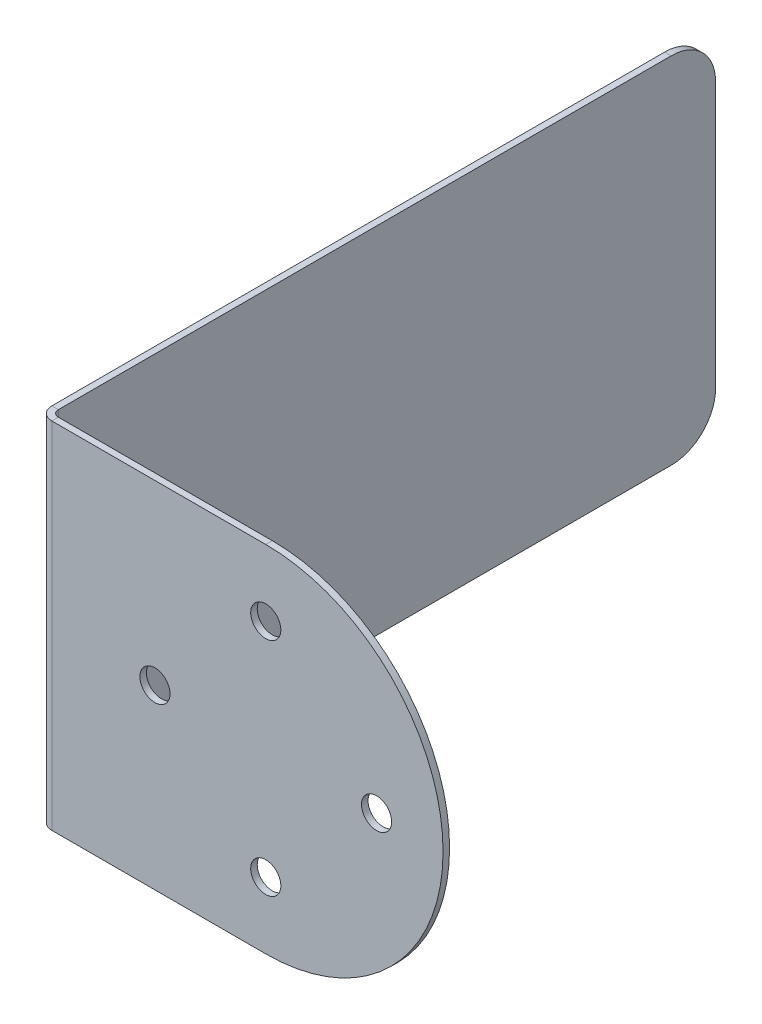
ISO-10303-21;
HEADER;
FILE_DESCRIPTION(('STEP AP214'),'2;1');
FILE_NAME('part.step','',(''),(''),'','','');
FILE_SCHEMA(('AUTOMOTIVE_DESIGN { 1 0 10303 214 1 1 1 1 }'));
ENDSEC;
DATA;
#1=APPLICATION_CONTEXT('core data for automotive mechanical design processes');
#2=APPLICATION_PROTOCOL_DEFINITION('international standard','automotive_design',2000,#1);
#3=PRODUCT_CONTEXT('',#1,'mechanical');
#4=PRODUCT('Part','Part','',(#3));
#5=PRODUCT_RELATED_PRODUCT_CATEGORY('part','',(#4));
#6=PRODUCT_DEFINITION_FORMATION('','',#4);
#7=PRODUCT_DEFINITION_CONTEXT('part definition',#1,'design');
#8=PRODUCT_DEFINITION('design','',#6,#7);
#9=PRODUCT_DEFINITION_SHAPE('','',#8);
#10=(LENGTH_UNIT() NAMED_UNIT(*) SI_UNIT(.MILLI.,.METRE.));
#11=(NAMED_UNIT(*) PLANE_ANGLE_UNIT() SI_UNIT($,.RADIAN.));
#12=(NAMED_UNIT(*) SI_UNIT($,.STERADIAN.) SOLID_ANGLE_UNIT());
#13=UNCERTAINTY_MEASURE_WITH_UNIT(LENGTH_MEASURE(1.E-05),#10,'distance_accuracy_value','');
#14=(GEOMETRIC_REPRESENTATION_CONTEXT(3) GLOBAL_UNCERTAINTY_ASSIGNED_CONTEXT((#13)) GLOBAL_UNIT_ASSIGNED_CONTEXT((#10,
#11,#12)) REPRESENTATION_CONTEXT('',''));
#15=CARTESIAN_POINT('',(0.,0.,0.));
#16=DIRECTION('',(0.,0.,1.));
#17=DIRECTION('',(1.,0.,0.));
#18=AXIS2_PLACEMENT_3D('',#15,#16,#17);
#19=CARTESIAN_POINT('',(24.8688135692622,0.,-25.1311864307379));
#20=DIRECTION('',(0.,0.,1.));
#21=DIRECTION('',(1.,0.,0.));
#22=AXIS2_PLACEMENT_3D('',#19,#20,#21);
#23=PLANE('',#22);
#24=CARTESIAN_POINT('',(37.3688135692622,0.,-25.131186430738));
#25=DIRECTION('',(0.,0.,1.));
#26=DIRECTION('',(0.,-1.,0.));
#27=AXIS2_PLACEMENT_3D('',#24,#25,#26);
#28=CIRCLE('',#27,1.7);
#29=CARTESIAN_POINT('',(37.3688135692622,-1.7,-25.131186430738));
#30=VERTEX_POINT('',#29);
#31=EDGE_CURVE('E465',#30,#30,#28,.T.);
#32=ORIENTED_EDGE('',*,*,#31,.T.);
#33=EDGE_LOOP('',(#32));
#34=FACE_BOUND('',#33,.T.);
#35=CARTESIAN_POINT('',(24.8688135692622,12.5,-25.1311864307379));
#36=DIRECTION('',(0.,0.,1.));
#37=DIRECTION('',(0.,-1.,0.));
#38=AXIS2_PLACEMENT_3D('',#35,#36,#37);
#39=CIRCLE('',#38,1.7);
#40=CARTESIAN_POINT('',(24.8688135692622,10.8,-25.1311864307379));
#41=VERTEX_POINT('',#40);
#42=EDGE_CURVE('E471',#41,#41,#39,.T.);
#43=ORIENTED_EDGE('',*,*,#42,.T.);
#44=EDGE_LOOP('',(#43));
#45=FACE_BOUND('',#44,.T.);
#46=CARTESIAN_POINT('',(12.3688135692622,0.,-25.1311864307379));
#47=DIRECTION('',(0.,0.,1.));
#48=DIRECTION('',(0.,-1.,0.));
#49=AXIS2_PLACEMENT_3D('',#46,#47,#48);
#50=CIRCLE('',#49,1.7);
#51=CARTESIAN_POINT('',(12.3688135692622,-1.69999999999999,-25.1311864307379));
#52=VERTEX_POINT('',#51);
#53=EDGE_CURVE('E479',#52,#52,#50,.T.);
#54=ORIENTED_EDGE('',*,*,#53,.T.);
#55=EDGE_LOOP('',(#54));
#56=FACE_BOUND('',#55,.T.);
#57=CARTESIAN_POINT('',(24.8688135692622,-12.5,-25.1311864307379));
#58=DIRECTION('',(0.,0.,1.));
#59=DIRECTION('',(0.,-1.,0.));
#60=AXIS2_PLACEMENT_3D('',#57,#58,#59);
#61=CIRCLE('',#60,1.7);
#62=CARTESIAN_POINT('',(24.8688135692622,-14.2,-25.1311864307379));
#63=VERTEX_POINT('',#62);
#64=EDGE_CURVE('E218',#63,#63,#61,.T.);
#65=ORIENTED_EDGE('',*,*,#64,.T.);
#66=EDGE_LOOP('',(#65));
#67=FACE_BOUND('',#66,.T.);
#68=DIRECTION('',(-1.,0.,0.));
#69=VECTOR('',#68,1.);
#70=CARTESIAN_POINT('',(24.8688135692622,-20.,-25.1311864307379));
#71=LINE('',#70,#69);
#72=CARTESIAN_POINT('',(24.8688135692622,-20.,-25.1311864307379));
#73=VERTEX_POINT('',#72);
#74=CARTESIAN_POINT('',(0.736600000000007,-20.,-25.1311864307378));
#75=VERTEX_POINT('',#74);
#76=EDGE_CURVE('E66',#73,#75,#71,.T.);
#77=ORIENTED_EDGE('',*,*,#76,.T.);
#78=DIRECTION('',(0.,1.,0.));
#79=VECTOR('',#78,1.);
#80=CARTESIAN_POINT('',(0.736600000000004,0.,-25.1311864307378));
#81=LINE('',#80,#79);
#82=CARTESIAN_POINT('',(0.7366,20.,-25.1311864307378));
#83=VERTEX_POINT('',#82);
#84=EDGE_CURVE('E59',#75,#83,#81,.T.);
#85=ORIENTED_EDGE('',*,*,#84,.T.);
#86=DIRECTION('',(1.,0.,0.));
#87=VECTOR('',#86,1.);
#88=CARTESIAN_POINT('',(24.8688135692622,20.,-25.1311864307379));
#89=LINE('',#88,#87);
#90=CARTESIAN_POINT('',(24.8688135692622,20.,-25.1311864307379));
#91=VERTEX_POINT('',#90);
#92=EDGE_CURVE('E74',#83,#91,#89,.T.);
#93=ORIENTED_EDGE('',*,*,#92,.T.);
#94=CARTESIAN_POINT('',(24.8688135692622,0.,-25.1311864307379));
#95=DIRECTION('',(0.,0.,-1.));
#96=DIRECTION('',(1.,0.,0.));
#97=AXIS2_PLACEMENT_3D('',#94,#95,#96);
#98=CIRCLE('',#97,20.);
#99=EDGE_CURVE('E186',#91,#73,#98,.T.);
#100=ORIENTED_EDGE('',*,*,#99,.T.);
#101=EDGE_LOOP('',(#77,#85,#93,#100));
#102=FACE_BOUND('',#101,.T.);
#103=ADVANCED_FACE('F47',(#34,#45,#56,#67,#102),#23,.F.);
#104=CARTESIAN_POINT('',(24.8688135692622,0.,-24.3945864307379));
#105=DIRECTION('',(0.,0.,-1.));
#106=DIRECTION('',(-1.,0.,0.));
#107=AXIS2_PLACEMENT_3D('',#104,#105,#106);
#108=CYLINDRICAL_SURFACE('',#107,20.);
#109=ORIENTED_EDGE('',*,*,#99,.F.);
#110=DIRECTION('',(0.,0.,-1.));
#111=VECTOR('',#110,1.);
#112=CARTESIAN_POINT('',(24.8688135692622,20.,-24.3945864307379));
#113=LINE('',#112,#111);
#114=CARTESIAN_POINT('',(24.8688135692622,20.,-24.3945864307379));
#115=VERTEX_POINT('',#114);
#116=EDGE_CURVE('E187',#115,#91,#113,.T.);
#117=ORIENTED_EDGE('',*,*,#116,.F.);
#118=CARTESIAN_POINT('',(24.8688135692622,0.,-24.3945864307379));
#119=DIRECTION('',(0.,0.,-1.));
#120=DIRECTION('',(1.,0.,0.));
#121=AXIS2_PLACEMENT_3D('',#118,#119,#120);
#122=CIRCLE('',#121,20.);
#123=CARTESIAN_POINT('',(24.8688135692622,-20.,-24.3945864307379));
#124=VERTEX_POINT('',#123);
#125=EDGE_CURVE('E181',#115,#124,#122,.T.);
#126=ORIENTED_EDGE('',*,*,#125,.T.);
#127=DIRECTION('',(0.,0.,-1.));
#128=VECTOR('',#127,1.);
#129=CARTESIAN_POINT('',(24.8688135692622,-20.,-24.3945864307379));
#130=LINE('',#129,#128);
#131=EDGE_CURVE('E195',#124,#73,#130,.T.);
#132=ORIENTED_EDGE('',*,*,#131,.T.);
#133=EDGE_LOOP('',(#109,#117,#126,#132));
#134=FACE_BOUND('',#133,.T.);
#135=ADVANCED_FACE('F210',(#134),#108,.T.);
#136=CARTESIAN_POINT('',(24.8688135692622,20.,-24.3945864307379));
#137=DIRECTION('',(0.,1.,0.));
#138=DIRECTION('',(1.,0.,0.));
#139=AXIS2_PLACEMENT_3D('',#136,#137,#138);
#140=PLANE('',#139);
#141=DIRECTION('',(0.,0.,-1.));
#142=VECTOR('',#141,1.);
#143=CARTESIAN_POINT('',(0.736600000000007,20.,-24.3945864307378));
#144=LINE('',#143,#142);
#145=CARTESIAN_POINT('',(0.736600000000004,20.,-24.3945864307378));
#146=VERTEX_POINT('',#145);
#147=EDGE_CURVE('E192',#146,#83,#144,.T.);
#148=ORIENTED_EDGE('',*,*,#147,.F.);
#149=DIRECTION('',(1.,0.,0.));
#150=VECTOR('',#149,1.);
#151=CARTESIAN_POINT('',(24.8688135692622,20.,-24.3945864307379));
#152=LINE('',#151,#150);
#153=EDGE_CURVE('E52',#146,#115,#152,.T.);
#154=ORIENTED_EDGE('',*,*,#153,.T.);
#155=ORIENTED_EDGE('',*,*,#116,.T.);
#156=ORIENTED_EDGE('',*,*,#92,.F.);
#157=EDGE_LOOP('',(#148,#154,#155,#156));
#158=FACE_BOUND('',#157,.T.);
#159=ADVANCED_FACE('F201',(#158),#140,.T.);
#160=CARTESIAN_POINT('',(24.8688135692622,-20.,-24.3945864307379));
#161=DIRECTION('',(0.,-1.,0.));
#162=DIRECTION('',(-1.,0.,0.));
#163=AXIS2_PLACEMENT_3D('',#160,#161,#162);
#164=PLANE('',#163);
#165=DIRECTION('',(0.,0.,1.));
#166=VECTOR('',#165,1.);
#167=CARTESIAN_POINT('',(0.736600000000007,-20.,-24.3945864307378));
#168=LINE('',#167,#166);
#169=CARTESIAN_POINT('',(0.736600000000011,-20.,-24.3945864307378));
#170=VERTEX_POINT('',#169);
#171=EDGE_CURVE('E12',#75,#170,#168,.T.);
#172=ORIENTED_EDGE('',*,*,#171,.F.);
#173=ORIENTED_EDGE('',*,*,#76,.F.);
#174=ORIENTED_EDGE('',*,*,#131,.F.);
#175=DIRECTION('',(-1.,0.,0.));
#176=VECTOR('',#175,1.);
#177=CARTESIAN_POINT('',(24.8688135692622,-20.,-24.3945864307379));
#178=LINE('',#177,#176);
#179=EDGE_CURVE('E189',#124,#170,#178,.T.);
#180=ORIENTED_EDGE('',*,*,#179,.T.);
#181=EDGE_LOOP('',(#172,#173,#174,#180));
#182=FACE_BOUND('',#181,.T.);
#183=ADVANCED_FACE('F51',(#182),#164,.T.);
#184=CARTESIAN_POINT('',(24.8688135692622,0.,-24.3945864307379));
#185=DIRECTION('',(0.,0.,1.));
#186=DIRECTION('',(1.,0.,0.));
#187=AXIS2_PLACEMENT_3D('',#184,#185,#186);
#188=PLANE('',#187);
#189=CARTESIAN_POINT('',(37.3688135692622,0.,-24.394586430738));
#190=DIRECTION('',(0.,0.,1.));
#191=DIRECTION('',(0.,-1.,0.));
#192=AXIS2_PLACEMENT_3D('',#189,#190,#191);
#193=CIRCLE('',#192,1.69999999999999);
#194=CARTESIAN_POINT('',(37.3688135692622,-1.69999999999999,-24.394586430738));
#195=VERTEX_POINT('',#194);
#196=EDGE_CURVE('E468',#195,#195,#193,.T.);
#197=ORIENTED_EDGE('',*,*,#196,.F.);
#198=EDGE_LOOP('',(#197));
#199=FACE_BOUND('',#198,.T.);
#200=CARTESIAN_POINT('',(24.8688135692622,12.5,-24.3945864307379));
#201=DIRECTION('',(0.,0.,1.));
#202=DIRECTION('',(0.,-1.,0.));
#203=AXIS2_PLACEMENT_3D('',#200,#201,#202);
#204=CIRCLE('',#203,1.69999999999999);
#205=CARTESIAN_POINT('',(24.8688135692622,10.8,-24.3945864307379));
#206=VERTEX_POINT('',#205);
#207=EDGE_CURVE('E466',#206,#206,#204,.T.);
#208=ORIENTED_EDGE('',*,*,#207,.F.);
#209=EDGE_LOOP('',(#208));
#210=FACE_BOUND('',#209,.T.);
#211=CARTESIAN_POINT('',(12.3688135692622,0.,-24.3945864307379));
#212=DIRECTION('',(0.,0.,1.));
#213=DIRECTION('',(0.,-1.,0.));
#214=AXIS2_PLACEMENT_3D('',#211,#212,#213);
#215=CIRCLE('',#214,1.69999999999999);
#216=CARTESIAN_POINT('',(12.3688135692622,-1.69999999999998,-24.3945864307379));
#217=VERTEX_POINT('',#216);
#218=EDGE_CURVE('E478',#217,#217,#215,.T.);
#219=ORIENTED_EDGE('',*,*,#218,.F.);
#220=EDGE_LOOP('',(#219));
#221=FACE_BOUND('',#220,.T.);
#222=CARTESIAN_POINT('',(24.8688135692622,-12.5,-24.3945864307379));
#223=DIRECTION('',(0.,0.,1.));
#224=DIRECTION('',(0.,-1.,0.));
#225=AXIS2_PLACEMENT_3D('',#222,#223,#224);
#226=CIRCLE('',#225,1.69999999999999);
#227=CARTESIAN_POINT('',(24.8688135692622,-14.2,-24.3945864307379));
#228=VERTEX_POINT('',#227);
#229=EDGE_CURVE('E224',#228,#228,#226,.T.);
#230=ORIENTED_EDGE('',*,*,#229,.F.);
#231=EDGE_LOOP('',(#230));
#232=FACE_BOUND('',#231,.T.);
#233=DIRECTION('',(0.,1.,0.));
#234=VECTOR('',#233,1.);
#235=CARTESIAN_POINT('',(0.736600000000007,0.,-24.3945864307378));
#236=LINE('',#235,#234);
#237=EDGE_CURVE('E147',#170,#146,#236,.T.);
#238=ORIENTED_EDGE('',*,*,#237,.F.);
#239=ORIENTED_EDGE('',*,*,#179,.F.);
#240=ORIENTED_EDGE('',*,*,#125,.F.);
#241=ORIENTED_EDGE('',*,*,#153,.F.);
#242=EDGE_LOOP('',(#238,#239,#240,#241));
#243=FACE_BOUND('',#242,.T.);
#244=ADVANCED_FACE('F276',(#199,#210,#221,#232,#243),#188,.T.);
#245=CARTESIAN_POINT('',(-0.7366,-15.,-95.));
#246=DIRECTION('',(1.,0.,0.));
#247=DIRECTION('',(0.,0.,-1.));
#248=AXIS2_PLACEMENT_3D('',#245,#246,#247);
#249=CYLINDRICAL_SURFACE('',#248,5.);
#250=CARTESIAN_POINT('',(0.,-15.,-95.));
#251=DIRECTION('',(1.,0.,0.));
#252=DIRECTION('',(0.,0.,-1.));
#253=AXIS2_PLACEMENT_3D('',#250,#251,#252);
#254=CIRCLE('',#253,5.);
#255=CARTESIAN_POINT('',(0.,-20.,-95.));
#256=VERTEX_POINT('',#255);
#257=CARTESIAN_POINT('',(0.,-15.,-100.));
#258=VERTEX_POINT('',#257);
#259=EDGE_CURVE('E238',#256,#258,#254,.T.);
#260=ORIENTED_EDGE('',*,*,#259,.F.);
#261=DIRECTION('',(1.,0.,0.));
#262=VECTOR('',#261,1.);
#263=CARTESIAN_POINT('',(-0.7366,-20.,-95.));
#264=LINE('',#263,#262);
#265=CARTESIAN_POINT('',(-0.7366,-20.,-95.));
#266=VERTEX_POINT('',#265);
#267=EDGE_CURVE('E188',#266,#256,#264,.T.);
#268=ORIENTED_EDGE('',*,*,#267,.F.);
#269=CARTESIAN_POINT('',(-0.7366,-15.,-95.));
#270=DIRECTION('',(1.,0.,0.));
#271=DIRECTION('',(0.,0.,-1.));
#272=AXIS2_PLACEMENT_3D('',#269,#270,#271);
#273=CIRCLE('',#272,5.);
#274=CARTESIAN_POINT('',(-0.7366,-15.,-100.));
#275=VERTEX_POINT('',#274);
#276=EDGE_CURVE('E178',#266,#275,#273,.T.);
#277=ORIENTED_EDGE('',*,*,#276,.T.);
#278=DIRECTION('',(1.,0.,0.));
#279=VECTOR('',#278,1.);
#280=CARTESIAN_POINT('',(-0.7366,-15.,-100.));
#281=LINE('',#280,#279);
#282=EDGE_CURVE('E177',#275,#258,#281,.T.);
#283=ORIENTED_EDGE('',*,*,#282,.T.);
#284=EDGE_LOOP('',(#260,#268,#277,#283));
#285=FACE_BOUND('',#284,.T.);
#286=ADVANCED_FACE('F247',(#285),#249,.T.);
#287=CARTESIAN_POINT('',(-0.7366,-14.9999999999999,-100.));
#288=DIRECTION('',(0.,0.,-1.));
#289=DIRECTION('',(-1.,0.,0.));
#290=AXIS2_PLACEMENT_3D('',#287,#288,#289);
#291=PLANE('',#290);
#292=DIRECTION('',(0.,1.,0.));
#293=VECTOR('',#292,1.);
#294=CARTESIAN_POINT('',(0.,-14.9999999999999,-100.));
#295=LINE('',#294,#293);
#296=CARTESIAN_POINT('',(0.,14.9999999999999,-100.));
#297=VERTEX_POINT('',#296);
#298=EDGE_CURVE('E240',#258,#297,#295,.T.);
#299=ORIENTED_EDGE('',*,*,#298,.F.);
#300=ORIENTED_EDGE('',*,*,#282,.F.);
#301=DIRECTION('',(0.,1.,0.));
#302=VECTOR('',#301,1.);
#303=CARTESIAN_POINT('',(-0.7366,-14.9999999999999,-100.));
#304=LINE('',#303,#302);
#305=CARTESIAN_POINT('',(-0.7366,14.9999999999999,-100.));
#306=VERTEX_POINT('',#305);
#307=EDGE_CURVE('E173',#275,#306,#304,.T.);
#308=ORIENTED_EDGE('',*,*,#307,.T.);
#309=DIRECTION('',(1.,0.,0.));
#310=VECTOR('',#309,1.);
#311=CARTESIAN_POINT('',(-0.7366,14.9999999999999,-100.));
#312=LINE('',#311,#310);
#313=EDGE_CURVE('E175',#306,#297,#312,.T.);
#314=ORIENTED_EDGE('',*,*,#313,.T.);
#315=EDGE_LOOP('',(#299,#300,#308,#314));
#316=FACE_BOUND('',#315,.T.);
#317=ADVANCED_FACE('F255',(#316),#291,.T.);
#318=CARTESIAN_POINT('',(-0.7366,15.,-95.));
#319=DIRECTION('',(1.,0.,0.));
#320=DIRECTION('',(0.,0.,-1.));
#321=AXIS2_PLACEMENT_3D('',#318,#319,#320);
#322=CYLINDRICAL_SURFACE('',#321,5.);
#323=CARTESIAN_POINT('',(0.,15.,-95.));
#324=DIRECTION('',(1.,0.,0.));
#325=DIRECTION('',(0.,0.,-1.));
#326=AXIS2_PLACEMENT_3D('',#323,#324,#325);
#327=CIRCLE('',#326,5.);
#328=CARTESIAN_POINT('',(0.,20.,-95.));
#329=VERTEX_POINT('',#328);
#330=EDGE_CURVE('E233',#297,#329,#327,.T.);
#331=ORIENTED_EDGE('',*,*,#330,.F.);
#332=ORIENTED_EDGE('',*,*,#313,.F.);
#333=CARTESIAN_POINT('',(-0.7366,15.,-95.));
#334=DIRECTION('',(1.,0.,0.));
#335=DIRECTION('',(0.,0.,-1.));
#336=AXIS2_PLACEMENT_3D('',#333,#334,#335);
#337=CIRCLE('',#336,5.);
#338=CARTESIAN_POINT('',(-0.7366,20.,-95.));
#339=VERTEX_POINT('',#338);
#340=EDGE_CURVE('E168',#306,#339,#337,.T.);
#341=ORIENTED_EDGE('',*,*,#340,.T.);
#342=DIRECTION('',(1.,0.,0.));
#343=VECTOR('',#342,1.);
#344=CARTESIAN_POINT('',(-0.7366,20.,-95.));
#345=LINE('',#344,#343);
#346=EDGE_CURVE('E165',#339,#329,#345,.T.);
#347=ORIENTED_EDGE('',*,*,#346,.T.);
#348=EDGE_LOOP('',(#331,#332,#341,#347));
#349=FACE_BOUND('',#348,.T.);
#350=ADVANCED_FACE('F260',(#349),#322,.T.);
#351=CARTESIAN_POINT('',(-0.7366,0.,0.));
#352=DIRECTION('',(-1.,0.,0.));
#353=DIRECTION('',(0.,0.,1.));
#354=AXIS2_PLACEMENT_3D('',#351,#352,#353);
#355=PLANE('',#354);
#356=DIRECTION('',(0.,0.,-1.));
#357=VECTOR('',#356,1.);
#358=CARTESIAN_POINT('',(-0.7366,-20.,0.));
#359=LINE('',#358,#357);
#360=CARTESIAN_POINT('',(-0.7366,-20.,-25.8677864307378));
#361=VERTEX_POINT('',#360);
#362=EDGE_CURVE('E159',#361,#266,#359,.T.);
#363=ORIENTED_EDGE('',*,*,#362,.F.);
#364=DIRECTION('',(0.,1.,0.));
#365=VECTOR('',#364,1.);
#366=CARTESIAN_POINT('',(-0.7366,0.,-25.8677864307378));
#367=LINE('',#366,#365);
#368=CARTESIAN_POINT('',(-0.7366,20.,-25.8677864307378));
#369=VERTEX_POINT('',#368);
#370=EDGE_CURVE('E146',#361,#369,#367,.T.);
#371=ORIENTED_EDGE('',*,*,#370,.T.);
#372=DIRECTION('',(0.,0.,1.));
#373=VECTOR('',#372,1.);
#374=CARTESIAN_POINT('',(-0.7366,20.,0.));
#375=LINE('',#374,#373);
#376=EDGE_CURVE('E143',#339,#369,#375,.T.);
#377=ORIENTED_EDGE('',*,*,#376,.F.);
#378=ORIENTED_EDGE('',*,*,#340,.F.);
#379=ORIENTED_EDGE('',*,*,#307,.F.);
#380=ORIENTED_EDGE('',*,*,#276,.F.);
#381=EDGE_LOOP('',(#363,#371,#377,#378,#379,#380));
#382=FACE_BOUND('',#381,.T.);
#383=ADVANCED_FACE('F160',(#382),#355,.T.);
#384=CARTESIAN_POINT('',(-0.7366,20.,0.));
#385=DIRECTION('',(0.,1.,0.));
#386=DIRECTION('',(0.,0.,1.));
#387=AXIS2_PLACEMENT_3D('',#384,#385,#386);
#388=PLANE('',#387);
#389=ORIENTED_EDGE('',*,*,#376,.T.);
#390=DIRECTION('',(1.,0.,0.));
#391=VECTOR('',#390,1.);
#392=CARTESIAN_POINT('',(-0.736600000000002,20.,-25.8677864307378));
#393=LINE('',#392,#391);
#394=CARTESIAN_POINT('',(0.,20.,-25.8677864307378));
#395=VERTEX_POINT('',#394);
#396=EDGE_CURVE('E129',#369,#395,#393,.T.);
#397=ORIENTED_EDGE('',*,*,#396,.T.);
#398=DIRECTION('',(0.,0.,1.));
#399=VECTOR('',#398,1.);
#400=CARTESIAN_POINT('',(0.,20.,0.));
#401=LINE('',#400,#399);
#402=EDGE_CURVE('E231',#329,#395,#401,.T.);
#403=ORIENTED_EDGE('',*,*,#402,.F.);
#404=ORIENTED_EDGE('',*,*,#346,.F.);
#405=EDGE_LOOP('',(#389,#397,#403,#404));
#406=FACE_BOUND('',#405,.T.);
#407=ADVANCED_FACE('F163',(#406),#388,.T.);
#408=CARTESIAN_POINT('',(0.,0.,0.));
#409=DIRECTION('',(-1.,0.,0.));
#410=DIRECTION('',(0.,0.,1.));
#411=AXIS2_PLACEMENT_3D('',#408,#409,#410);
#412=PLANE('',#411);
#413=DIRECTION('',(0.,1.,0.));
#414=VECTOR('',#413,1.);
#415=CARTESIAN_POINT('',(0.,0.,-25.8677864307378));
#416=LINE('',#415,#414);
#417=CARTESIAN_POINT('',(0.,-20.,-25.8677864307378));
#418=VERTEX_POINT('',#417);
#419=EDGE_CURVE('E151',#418,#395,#416,.T.);
#420=ORIENTED_EDGE('',*,*,#419,.F.);
#421=DIRECTION('',(0.,0.,-1.));
#422=VECTOR('',#421,1.);
#423=CARTESIAN_POINT('',(0.,-20.,0.));
#424=LINE('',#423,#422);
#425=EDGE_CURVE('E137',#418,#256,#424,.T.);
#426=ORIENTED_EDGE('',*,*,#425,.T.);
#427=ORIENTED_EDGE('',*,*,#259,.T.);
#428=ORIENTED_EDGE('',*,*,#298,.T.);
#429=ORIENTED_EDGE('',*,*,#330,.T.);
#430=ORIENTED_EDGE('',*,*,#402,.T.);
#431=EDGE_LOOP('',(#420,#426,#427,#428,#429,#430));
#432=FACE_BOUND('',#431,.T.);
#433=ADVANCED_FACE('F243',(#432),#412,.F.);
#434=CARTESIAN_POINT('',(-0.7366,-20.,0.));
#435=DIRECTION('',(0.,-1.,0.));
#436=DIRECTION('',(0.,0.,-1.));
#437=AXIS2_PLACEMENT_3D('',#434,#435,#436);
#438=PLANE('',#437);
#439=ORIENTED_EDGE('',*,*,#425,.F.);
#440=DIRECTION('',(-1.,0.,0.));
#441=VECTOR('',#440,1.);
#442=CARTESIAN_POINT('',(-0.736600000000002,-20.,-25.8677864307378));
#443=LINE('',#442,#441);
#444=EDGE_CURVE('E217',#418,#361,#443,.T.);
#445=ORIENTED_EDGE('',*,*,#444,.T.);
#446=ORIENTED_EDGE('',*,*,#362,.T.);
#447=ORIENTED_EDGE('',*,*,#267,.T.);
#448=EDGE_LOOP('',(#439,#445,#446,#447));
#449=FACE_BOUND('',#448,.T.);
#450=ADVANCED_FACE('F246',(#449),#438,.T.);
#451=CARTESIAN_POINT('',(0.7366,-20.,-25.8677864307378));
#452=DIRECTION('',(0.,-1.,0.));
#453=DIRECTION('',(0.,0.,-1.));
#454=AXIS2_PLACEMENT_3D('',#451,#452,#453);
#455=PLANE('',#454);
#456=ORIENTED_EDGE('',*,*,#444,.F.);
#457=CARTESIAN_POINT('',(0.7366,-20.,-25.8677864307378));
#458=DIRECTION('',(0.,1.,0.));
#459=DIRECTION('',(0.,0.,1.));
#460=AXIS2_PLACEMENT_3D('',#457,#458,#459);
#461=CIRCLE('',#460,0.7366);
#462=EDGE_CURVE('E214',#418,#75,#461,.T.);
#463=ORIENTED_EDGE('',*,*,#462,.T.);
#464=ORIENTED_EDGE('',*,*,#171,.T.);
#465=CARTESIAN_POINT('',(0.7366,-20.,-25.8677864307378));
#466=DIRECTION('',(0.,1.,0.));
#467=DIRECTION('',(0.,0.,-1.));
#468=AXIS2_PLACEMENT_3D('',#465,#466,#467);
#469=CIRCLE('',#468,1.4732);
#470=EDGE_CURVE('E155',#361,#170,#469,.T.);
#471=ORIENTED_EDGE('',*,*,#470,.F.);
#472=EDGE_LOOP('',(#456,#463,#464,#471));
#473=FACE_BOUND('',#472,.T.);
#474=ADVANCED_FACE('F220',(#473),#455,.T.);
#475=CARTESIAN_POINT('',(0.7366,20.,-25.8677864307378));
#476=DIRECTION('',(0.,1.,0.));
#477=DIRECTION('',(0.,0.,1.));
#478=AXIS2_PLACEMENT_3D('',#475,#476,#477);
#479=PLANE('',#478);
#480=CARTESIAN_POINT('',(0.7366,20.,-25.8677864307378));
#481=DIRECTION('',(0.,1.,0.));
#482=DIRECTION('',(0.,0.,1.));
#483=AXIS2_PLACEMENT_3D('',#480,#481,#482);
#484=CIRCLE('',#483,0.7366);
#485=EDGE_CURVE('E132',#83,#395,#484,.F.);
#486=ORIENTED_EDGE('',*,*,#485,.T.);
#487=ORIENTED_EDGE('',*,*,#396,.F.);
#488=CARTESIAN_POINT('',(0.7366,20.,-25.8677864307378));
#489=DIRECTION('',(0.,-1.,0.));
#490=DIRECTION('',(0.,0.,1.));
#491=AXIS2_PLACEMENT_3D('',#488,#489,#490);
#492=CIRCLE('',#491,1.4732);
#493=EDGE_CURVE('E135',#146,#369,#492,.T.);
#494=ORIENTED_EDGE('',*,*,#493,.F.);
#495=ORIENTED_EDGE('',*,*,#147,.T.);
#496=EDGE_LOOP('',(#486,#487,#494,#495));
#497=FACE_BOUND('',#496,.T.);
#498=ADVANCED_FACE('F134',(#497),#479,.T.);
#499=CARTESIAN_POINT('',(0.7366,-40.0444102555836,-25.8677864307378));
#500=DIRECTION('',(0.,1.,0.));
#501=DIRECTION('',(0.,0.,1.));
#502=AXIS2_PLACEMENT_3D('',#499,#500,#501);
#503=CYLINDRICAL_SURFACE('',#502,1.4732);
#504=ORIENTED_EDGE('',*,*,#237,.T.);
#505=ORIENTED_EDGE('',*,*,#493,.T.);
#506=ORIENTED_EDGE('',*,*,#370,.F.);
#507=ORIENTED_EDGE('',*,*,#470,.T.);
#508=EDGE_LOOP('',(#504,#505,#506,#507));
#509=FACE_BOUND('',#508,.T.);
#510=ADVANCED_FACE('F148',(#509),#503,.T.);
#511=CARTESIAN_POINT('',(0.7366,-40.0444102555836,-25.8677864307378));
#512=DIRECTION('',(0.,1.,0.));
#513=DIRECTION('',(0.,0.,1.));
#514=AXIS2_PLACEMENT_3D('',#511,#512,#513);
#515=CYLINDRICAL_SURFACE('',#514,0.7366);
#516=ORIENTED_EDGE('',*,*,#84,.F.);
#517=ORIENTED_EDGE('',*,*,#462,.F.);
#518=ORIENTED_EDGE('',*,*,#419,.T.);
#519=ORIENTED_EDGE('',*,*,#485,.F.);
#520=EDGE_LOOP('',(#516,#517,#518,#519));
#521=FACE_BOUND('',#520,.T.);
#522=ADVANCED_FACE('F212',(#521),#515,.F.);
#523=CARTESIAN_POINT('',(24.8688135692622,-12.5,-24.3945864307379));
#524=DIRECTION('',(0.,0.,1.));
#525=DIRECTION('',(0.,-1.,0.));
#526=AXIS2_PLACEMENT_3D('',#523,#524,#525);
#527=CYLINDRICAL_SURFACE('',#526,1.69999999999999);
#528=ORIENTED_EDGE('',*,*,#64,.F.);
#529=EDGE_LOOP('',(#528));
#530=FACE_BOUND('',#529,.T.);
#531=ORIENTED_EDGE('',*,*,#229,.T.);
#532=EDGE_LOOP('',(#531));
#533=FACE_BOUND('',#532,.T.);
#534=ADVANCED_FACE('F327',(#530,#533),#527,.F.);
#535=CARTESIAN_POINT('',(12.3688135692622,0.,-24.3945864307379));
#536=DIRECTION('',(0.,0.,1.));
#537=DIRECTION('',(0.,-1.,0.));
#538=AXIS2_PLACEMENT_3D('',#535,#536,#537);
#539=CYLINDRICAL_SURFACE('',#538,1.69999999999999);
#540=ORIENTED_EDGE('',*,*,#53,.F.);
#541=EDGE_LOOP('',(#540));
#542=FACE_BOUND('',#541,.T.);
#543=ORIENTED_EDGE('',*,*,#218,.T.);
#544=EDGE_LOOP('',(#543));
#545=FACE_BOUND('',#544,.T.);
#546=ADVANCED_FACE('F341',(#542,#545),#539,.F.);
#547=CARTESIAN_POINT('',(24.8688135692622,12.5,-24.3945864307379));
#548=DIRECTION('',(0.,0.,1.));
#549=DIRECTION('',(0.,-1.,0.));
#550=AXIS2_PLACEMENT_3D('',#547,#548,#549);
#551=CYLINDRICAL_SURFACE('',#550,1.69999999999999);
#552=ORIENTED_EDGE('',*,*,#42,.F.);
#553=EDGE_LOOP('',(#552));
#554=FACE_BOUND('',#553,.T.);
#555=ORIENTED_EDGE('',*,*,#207,.T.);
#556=EDGE_LOOP('',(#555));
#557=FACE_BOUND('',#556,.T.);
#558=ADVANCED_FACE('F354',(#554,#557),#551,.F.);
#559=CARTESIAN_POINT('',(37.3688135692622,0.,-24.394586430738));
#560=DIRECTION('',(0.,0.,1.));
#561=DIRECTION('',(0.,-1.,0.));
#562=AXIS2_PLACEMENT_3D('',#559,#560,#561);
#563=CYLINDRICAL_SURFACE('',#562,1.7);
#564=ORIENTED_EDGE('',*,*,#31,.F.);
#565=EDGE_LOOP('',(#564));
#566=FACE_BOUND('',#565,.T.);
#567=ORIENTED_EDGE('',*,*,#196,.T.);
#568=EDGE_LOOP('',(#567));
#569=FACE_BOUND('',#568,.T.);
#570=ADVANCED_FACE('F363',(#566,#569),#563,.F.);
#571=CLOSED_SHELL('',(#103,#135,#159,#183,#244,#286,#317,#350,#383,#407,#433,#450,#474,#498,
#510,#522,#534,#546,#558,#570));
#572=MANIFOLD_SOLID_BREP('B2',#571);
#573=ADVANCED_BREP_SHAPE_REPRESENTATION('',(#18,#572),#14);
#574=SHAPE_DEFINITION_REPRESENTATION(#9,#573);
ENDSEC;
END-ISO-10303-21;
